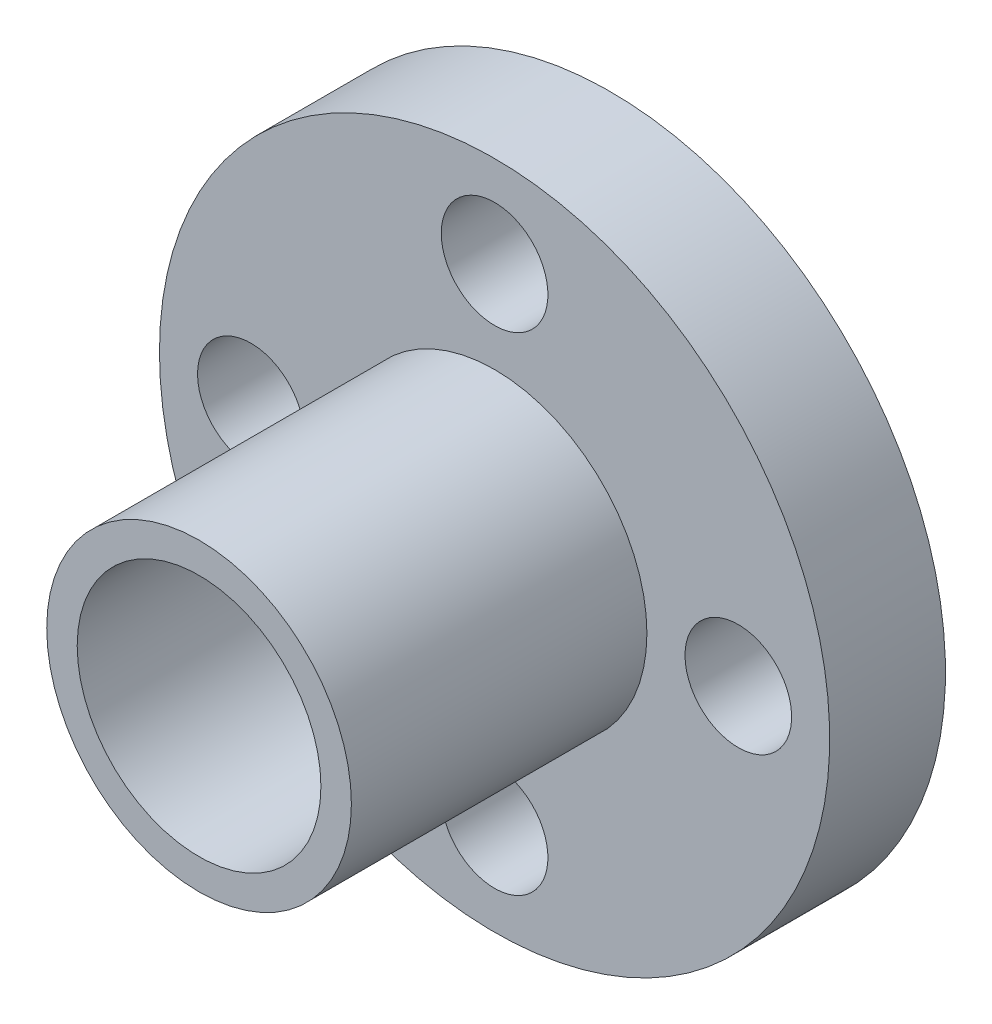
ISO-10303-21;
HEADER;
FILE_DESCRIPTION(('STEP AP214'),'2;1');
FILE_NAME('part.step','',(''),(''),'','','');
FILE_SCHEMA(('AUTOMOTIVE_DESIGN { 1 0 10303 214 1 1 1 1 }'));
ENDSEC;
DATA;
#1=APPLICATION_CONTEXT('core data for automotive mechanical design processes');
#2=APPLICATION_PROTOCOL_DEFINITION('international standard','automotive_design',2000,#1);
#3=PRODUCT_CONTEXT('',#1,'mechanical');
#4=PRODUCT('Part','Part','',(#3));
#5=PRODUCT_RELATED_PRODUCT_CATEGORY('part','',(#4));
#6=PRODUCT_DEFINITION_FORMATION('','',#4);
#7=PRODUCT_DEFINITION_CONTEXT('part definition',#1,'design');
#8=PRODUCT_DEFINITION('design','',#6,#7);
#9=PRODUCT_DEFINITION_SHAPE('','',#8);
#10=(LENGTH_UNIT() NAMED_UNIT(*) SI_UNIT(.MILLI.,.METRE.));
#11=(NAMED_UNIT(*) PLANE_ANGLE_UNIT() SI_UNIT($,.RADIAN.));
#12=(NAMED_UNIT(*) SI_UNIT($,.STERADIAN.) SOLID_ANGLE_UNIT());
#13=UNCERTAINTY_MEASURE_WITH_UNIT(LENGTH_MEASURE(1.E-05),#10,'distance_accuracy_value','');
#14=(GEOMETRIC_REPRESENTATION_CONTEXT(3) GLOBAL_UNCERTAINTY_ASSIGNED_CONTEXT((#13)) GLOBAL_UNIT_ASSIGNED_CONTEXT((#10,
#11,#12)) REPRESENTATION_CONTEXT('',''));
#15=CARTESIAN_POINT('',(0.,0.,0.));
#16=DIRECTION('',(0.,0.,1.));
#17=DIRECTION('',(1.,0.,0.));
#18=AXIS2_PLACEMENT_3D('',#15,#16,#17);
#19=CARTESIAN_POINT('',(0.,0.,3.8));
#20=DIRECTION('',(0.,0.,1.));
#21=DIRECTION('',(1.,0.,0.));
#22=AXIS2_PLACEMENT_3D('',#19,#20,#21);
#23=PLANE('',#22);
#24=CARTESIAN_POINT('',(8.,0.,3.8));
#25=DIRECTION('',(0.,0.,1.));
#26=DIRECTION('',(1.,0.,0.));
#27=AXIS2_PLACEMENT_3D('',#24,#25,#26);
#28=CIRCLE('',#27,1.75);
#29=CARTESIAN_POINT('',(6.25,0.,3.8));
#30=VERTEX_POINT('',#29);
#31=EDGE_CURVE('E57',#30,#30,#28,.T.);
#32=ORIENTED_EDGE('',*,*,#31,.F.);
#33=EDGE_LOOP('',(#32));
#34=FACE_BOUND('',#33,.T.);
#35=CARTESIAN_POINT('',(-8.,0.,3.8));
#36=DIRECTION('',(0.,0.,1.));
#37=DIRECTION('',(1.,0.,0.));
#38=AXIS2_PLACEMENT_3D('',#35,#36,#37);
#39=CIRCLE('',#38,1.75);
#40=CARTESIAN_POINT('',(-9.75,0.,3.8));
#41=VERTEX_POINT('',#40);
#42=EDGE_CURVE('E47',#41,#41,#39,.T.);
#43=ORIENTED_EDGE('',*,*,#42,.F.);
#44=EDGE_LOOP('',(#43));
#45=FACE_BOUND('',#44,.T.);
#46=CARTESIAN_POINT('',(0.,0.,3.8));
#47=DIRECTION('',(0.,0.,1.));
#48=DIRECTION('',(1.,0.,0.));
#49=AXIS2_PLACEMENT_3D('',#46,#47,#48);
#50=CIRCLE('',#49,11.);
#51=CARTESIAN_POINT('',(-11.,0.,3.8));
#52=VERTEX_POINT('',#51);
#53=EDGE_CURVE('E10',#52,#52,#50,.T.);
#54=ORIENTED_EDGE('',*,*,#53,.T.);
#55=EDGE_LOOP('',(#54));
#56=FACE_BOUND('',#55,.T.);
#57=CARTESIAN_POINT('',(0.,0.,3.8));
#58=DIRECTION('',(0.,0.,1.));
#59=DIRECTION('',(1.,0.,0.));
#60=AXIS2_PLACEMENT_3D('',#57,#58,#59);
#61=CIRCLE('',#60,5.);
#62=CARTESIAN_POINT('',(5.,0.,3.8));
#63=VERTEX_POINT('',#62);
#64=EDGE_CURVE('E43',#63,#63,#61,.T.);
#65=ORIENTED_EDGE('',*,*,#64,.F.);
#66=EDGE_LOOP('',(#65));
#67=FACE_BOUND('',#66,.T.);
#68=CARTESIAN_POINT('',(0.,8.,3.8));
#69=DIRECTION('',(0.,0.,1.));
#70=DIRECTION('',(1.,0.,0.));
#71=AXIS2_PLACEMENT_3D('',#68,#69,#70);
#72=CIRCLE('',#71,1.75);
#73=CARTESIAN_POINT('',(-1.74999999999997,8.,3.8));
#74=VERTEX_POINT('',#73);
#75=EDGE_CURVE('E51',#74,#74,#72,.T.);
#76=ORIENTED_EDGE('',*,*,#75,.F.);
#77=EDGE_LOOP('',(#76));
#78=FACE_BOUND('',#77,.T.);
#79=CARTESIAN_POINT('',(0.,-8.,3.8));
#80=DIRECTION('',(0.,0.,1.));
#81=DIRECTION('',(1.,0.,0.));
#82=AXIS2_PLACEMENT_3D('',#79,#80,#81);
#83=CIRCLE('',#82,1.75);
#84=CARTESIAN_POINT('',(-1.75000000000008,-8.,3.8));
#85=VERTEX_POINT('',#84);
#86=EDGE_CURVE('E63',#85,#85,#83,.T.);
#87=ORIENTED_EDGE('',*,*,#86,.F.);
#88=EDGE_LOOP('',(#87));
#89=FACE_BOUND('',#88,.T.);
#90=ADVANCED_FACE('F32',(#34,#45,#56,#67,#78,#89),#23,.T.);
#91=CARTESIAN_POINT('',(0.,0.,0.));
#92=DIRECTION('',(0.,0.,1.));
#93=DIRECTION('',(1.,0.,0.));
#94=AXIS2_PLACEMENT_3D('',#91,#92,#93);
#95=PLANE('',#94);
#96=CARTESIAN_POINT('',(8.,0.,0.));
#97=DIRECTION('',(0.,0.,1.));
#98=DIRECTION('',(1.,0.,0.));
#99=AXIS2_PLACEMENT_3D('',#96,#97,#98);
#100=CIRCLE('',#99,1.75);
#101=CARTESIAN_POINT('',(6.25,0.,0.));
#102=VERTEX_POINT('',#101);
#103=EDGE_CURVE('E60',#102,#102,#100,.T.);
#104=ORIENTED_EDGE('',*,*,#103,.T.);
#105=EDGE_LOOP('',(#104));
#106=FACE_BOUND('',#105,.T.);
#107=CARTESIAN_POINT('',(-8.,0.,0.));
#108=DIRECTION('',(0.,0.,1.));
#109=DIRECTION('',(1.,0.,0.));
#110=AXIS2_PLACEMENT_3D('',#107,#108,#109);
#111=CIRCLE('',#110,1.75);
#112=CARTESIAN_POINT('',(-9.75,0.,0.));
#113=VERTEX_POINT('',#112);
#114=EDGE_CURVE('E48',#113,#113,#111,.T.);
#115=ORIENTED_EDGE('',*,*,#114,.T.);
#116=EDGE_LOOP('',(#115));
#117=FACE_BOUND('',#116,.T.);
#118=CARTESIAN_POINT('',(0.,0.,0.));
#119=DIRECTION('',(0.,0.,1.));
#120=DIRECTION('',(1.,0.,0.));
#121=AXIS2_PLACEMENT_3D('',#118,#119,#120);
#122=CIRCLE('',#121,11.);
#123=CARTESIAN_POINT('',(-11.,0.,0.));
#124=VERTEX_POINT('',#123);
#125=EDGE_CURVE('E36',#124,#124,#122,.T.);
#126=ORIENTED_EDGE('',*,*,#125,.F.);
#127=EDGE_LOOP('',(#126));
#128=FACE_BOUND('',#127,.T.);
#129=CARTESIAN_POINT('',(0.,0.,0.));
#130=DIRECTION('',(0.,0.,1.));
#131=DIRECTION('',(1.,0.,0.));
#132=AXIS2_PLACEMENT_3D('',#129,#130,#131);
#133=CIRCLE('',#132,5.);
#134=CARTESIAN_POINT('',(5.,0.,0.));
#135=VERTEX_POINT('',#134);
#136=EDGE_CURVE('E69',#135,#135,#133,.T.);
#137=ORIENTED_EDGE('',*,*,#136,.T.);
#138=EDGE_LOOP('',(#137));
#139=FACE_BOUND('',#138,.T.);
#140=CARTESIAN_POINT('',(0.,8.,0.));
#141=DIRECTION('',(0.,0.,1.));
#142=DIRECTION('',(1.,0.,0.));
#143=AXIS2_PLACEMENT_3D('',#140,#141,#142);
#144=CIRCLE('',#143,1.75);
#145=CARTESIAN_POINT('',(-1.74999999999997,8.,0.));
#146=VERTEX_POINT('',#145);
#147=EDGE_CURVE('E54',#146,#146,#144,.T.);
#148=ORIENTED_EDGE('',*,*,#147,.T.);
#149=EDGE_LOOP('',(#148));
#150=FACE_BOUND('',#149,.T.);
#151=CARTESIAN_POINT('',(0.,-8.,0.));
#152=DIRECTION('',(0.,0.,1.));
#153=DIRECTION('',(1.,0.,0.));
#154=AXIS2_PLACEMENT_3D('',#151,#152,#153);
#155=CIRCLE('',#154,1.75);
#156=CARTESIAN_POINT('',(-1.75000000000008,-8.,0.));
#157=VERTEX_POINT('',#156);
#158=EDGE_CURVE('E66',#157,#157,#155,.T.);
#159=ORIENTED_EDGE('',*,*,#158,.T.);
#160=EDGE_LOOP('',(#159));
#161=FACE_BOUND('',#160,.T.);
#162=ADVANCED_FACE('F110',(#106,#117,#128,#139,#150,#161),#95,.F.);
#163=CARTESIAN_POINT('',(0.,0.,3.8));
#164=DIRECTION('',(0.,0.,-1.));
#165=DIRECTION('',(-1.,0.,0.));
#166=AXIS2_PLACEMENT_3D('',#163,#164,#165);
#167=CYLINDRICAL_SURFACE('',#166,11.);
#168=CARTESIAN_POINT('',(-11.,0.,3.8));
#169=CARTESIAN_POINT('',(-11.,0.,3.76041666666667));
#170=CARTESIAN_POINT('',(-11.,0.,3.72083333333333));
#171=CARTESIAN_POINT('',(-11.,0.,3.64166666666667));
#172=CARTESIAN_POINT('',(-11.,0.,3.60208333333333));
#173=CARTESIAN_POINT('',(-11.,0.,3.52291666666667));
#174=CARTESIAN_POINT('',(-11.,0.,3.48333333333333));
#175=CARTESIAN_POINT('',(-11.,0.,3.40416666666667));
#176=CARTESIAN_POINT('',(-11.,0.,3.36458333333333));
#177=CARTESIAN_POINT('',(-11.,0.,3.28541666666667));
#178=CARTESIAN_POINT('',(-11.,0.,3.24583333333333));
#179=CARTESIAN_POINT('',(-11.,0.,3.16666666666667));
#180=CARTESIAN_POINT('',(-11.,0.,3.12708333333333));
#181=CARTESIAN_POINT('',(-11.,0.,3.04791666666667));
#182=CARTESIAN_POINT('',(-11.,0.,3.00833333333333));
#183=CARTESIAN_POINT('',(-11.,0.,2.92916666666667));
#184=CARTESIAN_POINT('',(-11.,0.,2.88958333333333));
#185=CARTESIAN_POINT('',(-11.,0.,2.81041666666667));
#186=CARTESIAN_POINT('',(-11.,0.,2.77083333333333));
#187=CARTESIAN_POINT('',(-11.,0.,2.69166666666667));
#188=CARTESIAN_POINT('',(-11.,0.,2.65208333333333));
#189=CARTESIAN_POINT('',(-11.,0.,2.57291666666667));
#190=CARTESIAN_POINT('',(-11.,0.,2.53333333333333));
#191=CARTESIAN_POINT('',(-11.,0.,2.45416666666667));
#192=CARTESIAN_POINT('',(-11.,0.,2.41458333333333));
#193=CARTESIAN_POINT('',(-11.,0.,2.33541666666667));
#194=CARTESIAN_POINT('',(-11.,0.,2.29583333333333));
#195=CARTESIAN_POINT('',(-11.,0.,2.21666666666667));
#196=CARTESIAN_POINT('',(-11.,0.,2.17708333333333));
#197=CARTESIAN_POINT('',(-11.,0.,2.09791666666667));
#198=CARTESIAN_POINT('',(-11.,0.,2.05833333333333));
#199=CARTESIAN_POINT('',(-11.,0.,1.97916666666667));
#200=CARTESIAN_POINT('',(-11.,0.,1.93958333333333));
#201=CARTESIAN_POINT('',(-11.,0.,1.86041666666667));
#202=CARTESIAN_POINT('',(-11.,0.,1.82083333333333));
#203=CARTESIAN_POINT('',(-11.,0.,1.74166666666667));
#204=CARTESIAN_POINT('',(-11.,0.,1.70208333333333));
#205=CARTESIAN_POINT('',(-11.,0.,1.62291666666667));
#206=CARTESIAN_POINT('',(-11.,0.,1.58333333333333));
#207=CARTESIAN_POINT('',(-11.,0.,1.50416666666667));
#208=CARTESIAN_POINT('',(-11.,0.,1.46458333333333));
#209=CARTESIAN_POINT('',(-11.,0.,1.38541666666667));
#210=CARTESIAN_POINT('',(-11.,0.,1.34583333333333));
#211=CARTESIAN_POINT('',(-11.,0.,1.26666666666667));
#212=CARTESIAN_POINT('',(-11.,0.,1.22708333333333));
#213=CARTESIAN_POINT('',(-11.,0.,1.14791666666667));
#214=CARTESIAN_POINT('',(-11.,0.,1.10833333333333));
#215=CARTESIAN_POINT('',(-11.,0.,1.02916666666667));
#216=CARTESIAN_POINT('',(-11.,0.,0.989583333333333));
#217=CARTESIAN_POINT('',(-11.,0.,0.910416666666667));
#218=CARTESIAN_POINT('',(-11.,0.,0.870833333333333));
#219=CARTESIAN_POINT('',(-11.,0.,0.791666666666667));
#220=CARTESIAN_POINT('',(-11.,0.,0.752083333333333));
#221=CARTESIAN_POINT('',(-11.,0.,0.672916666666667));
#222=CARTESIAN_POINT('',(-11.,0.,0.633333333333333));
#223=CARTESIAN_POINT('',(-11.,0.,0.554166666666667));
#224=CARTESIAN_POINT('',(-11.,0.,0.514583333333334));
#225=CARTESIAN_POINT('',(-11.,0.,0.435416666666667));
#226=CARTESIAN_POINT('',(-11.,0.,0.395833333333333));
#227=CARTESIAN_POINT('',(-11.,0.,0.316666666666666));
#228=CARTESIAN_POINT('',(-11.,0.,0.277083333333333));
#229=CARTESIAN_POINT('',(-11.,0.,0.197916666666667));
#230=CARTESIAN_POINT('',(-11.,0.,0.158333333333333));
#231=CARTESIAN_POINT('',(-11.,0.,0.0791666666666666));
#232=CARTESIAN_POINT('',(-11.,0.,0.0395833333333333));
#233=CARTESIAN_POINT('',(-11.,0.,0.));
#234=B_SPLINE_CURVE_WITH_KNOTS('',3,(#168,#169,#170,#171,#172,#173,#174,#175,#176,#177,#178,
#179,#180,#181,#182,#183,#184,#185,#186,#187,#188,#189,#190,#191,#192,#193,#194,#195,#196,#197,
#198,#199,#200,#201,#202,#203,#204,#205,#206,#207,#208,#209,#210,#211,#212,#213,#214,#215,#216,
#217,#218,#219,#220,#221,#222,#223,#224,#225,#226,#227,#228,#229,#230,#231,#232,#233),
.UNSPECIFIED.,.F.,.F.,(4,2,2,2,2,2,2,2,2,2,2,2,2,2,2,2,2,2,2,2,2,2,2,2,2,2,2,2,2,2,2,2,4),(0.,
0.11875,0.2375,0.35625,0.475,0.59375,0.7125,0.831249999999999,0.95,1.06875,1.1875,1.30625,1.425,
1.54375,1.6625,1.78125,1.9,2.01875,2.1375,2.25625,2.375,2.49375,2.6125,2.73125,2.85,2.96875,
3.0875,3.20625,3.325,3.44375,3.5625,3.68125,3.8),.UNSPECIFIED.);
#235=EDGE_CURVE('BSEAM34',#52,#124,#234,.T.);
#236=ORIENTED_EDGE('',*,*,#53,.F.);
#237=ORIENTED_EDGE('',*,*,#125,.T.);
#238=ORIENTED_EDGE('',*,*,#235,.T.);
#239=ORIENTED_EDGE('',*,*,#235,.F.);
#240=EDGE_LOOP('',(#236,#238,#237,#239));
#241=FACE_BOUND('',#240,.T.);
#242=ADVANCED_FACE('F34',(#241),#167,.T.);
#243=CARTESIAN_POINT('',(-8.,0.,3.8));
#244=DIRECTION('',(0.,0.,-1.));
#245=DIRECTION('',(-1.,0.,0.));
#246=AXIS2_PLACEMENT_3D('',#243,#244,#245);
#247=CYLINDRICAL_SURFACE('',#246,1.75);
#248=CARTESIAN_POINT('',(-9.75,0.,3.8));
#249=CARTESIAN_POINT('',(-9.75,0.,3.76041666666667));
#250=CARTESIAN_POINT('',(-9.75,0.,3.72083333333333));
#251=CARTESIAN_POINT('',(-9.75,0.,3.64166666666667));
#252=CARTESIAN_POINT('',(-9.75,0.,3.60208333333333));
#253=CARTESIAN_POINT('',(-9.75,0.,3.52291666666667));
#254=CARTESIAN_POINT('',(-9.75,0.,3.48333333333333));
#255=CARTESIAN_POINT('',(-9.75,0.,3.40416666666667));
#256=CARTESIAN_POINT('',(-9.75,0.,3.36458333333333));
#257=CARTESIAN_POINT('',(-9.75,0.,3.28541666666667));
#258=CARTESIAN_POINT('',(-9.75,0.,3.24583333333333));
#259=CARTESIAN_POINT('',(-9.75,0.,3.16666666666667));
#260=CARTESIAN_POINT('',(-9.75,0.,3.12708333333333));
#261=CARTESIAN_POINT('',(-9.75,0.,3.04791666666667));
#262=CARTESIAN_POINT('',(-9.75,0.,3.00833333333333));
#263=CARTESIAN_POINT('',(-9.75,0.,2.92916666666667));
#264=CARTESIAN_POINT('',(-9.75,0.,2.88958333333333));
#265=CARTESIAN_POINT('',(-9.75,0.,2.81041666666667));
#266=CARTESIAN_POINT('',(-9.75,0.,2.77083333333333));
#267=CARTESIAN_POINT('',(-9.75,0.,2.69166666666667));
#268=CARTESIAN_POINT('',(-9.75,0.,2.65208333333333));
#269=CARTESIAN_POINT('',(-9.75,0.,2.57291666666667));
#270=CARTESIAN_POINT('',(-9.75,0.,2.53333333333333));
#271=CARTESIAN_POINT('',(-9.75,0.,2.45416666666667));
#272=CARTESIAN_POINT('',(-9.75,0.,2.41458333333333));
#273=CARTESIAN_POINT('',(-9.75,0.,2.33541666666667));
#274=CARTESIAN_POINT('',(-9.75,0.,2.29583333333333));
#275=CARTESIAN_POINT('',(-9.75,0.,2.21666666666667));
#276=CARTESIAN_POINT('',(-9.75,0.,2.17708333333333));
#277=CARTESIAN_POINT('',(-9.75,0.,2.09791666666667));
#278=CARTESIAN_POINT('',(-9.75,0.,2.05833333333333));
#279=CARTESIAN_POINT('',(-9.75,0.,1.97916666666667));
#280=CARTESIAN_POINT('',(-9.75,0.,1.93958333333333));
#281=CARTESIAN_POINT('',(-9.75,0.,1.86041666666667));
#282=CARTESIAN_POINT('',(-9.75,0.,1.82083333333333));
#283=CARTESIAN_POINT('',(-9.75,0.,1.74166666666667));
#284=CARTESIAN_POINT('',(-9.75,0.,1.70208333333333));
#285=CARTESIAN_POINT('',(-9.75,0.,1.62291666666667));
#286=CARTESIAN_POINT('',(-9.75,0.,1.58333333333333));
#287=CARTESIAN_POINT('',(-9.75,0.,1.50416666666667));
#288=CARTESIAN_POINT('',(-9.75,0.,1.46458333333333));
#289=CARTESIAN_POINT('',(-9.75,0.,1.38541666666667));
#290=CARTESIAN_POINT('',(-9.75,0.,1.34583333333333));
#291=CARTESIAN_POINT('',(-9.75,0.,1.26666666666667));
#292=CARTESIAN_POINT('',(-9.75,0.,1.22708333333333));
#293=CARTESIAN_POINT('',(-9.75,0.,1.14791666666667));
#294=CARTESIAN_POINT('',(-9.75,0.,1.10833333333333));
#295=CARTESIAN_POINT('',(-9.75,0.,1.02916666666667));
#296=CARTESIAN_POINT('',(-9.75,0.,0.989583333333333));
#297=CARTESIAN_POINT('',(-9.75,0.,0.910416666666667));
#298=CARTESIAN_POINT('',(-9.75,0.,0.870833333333333));
#299=CARTESIAN_POINT('',(-9.75,0.,0.791666666666667));
#300=CARTESIAN_POINT('',(-9.75,0.,0.752083333333333));
#301=CARTESIAN_POINT('',(-9.75,0.,0.672916666666667));
#302=CARTESIAN_POINT('',(-9.75,0.,0.633333333333333));
#303=CARTESIAN_POINT('',(-9.75,0.,0.554166666666667));
#304=CARTESIAN_POINT('',(-9.75,0.,0.514583333333334));
#305=CARTESIAN_POINT('',(-9.75,0.,0.435416666666667));
#306=CARTESIAN_POINT('',(-9.75,0.,0.395833333333333));
#307=CARTESIAN_POINT('',(-9.75,0.,0.316666666666666));
#308=CARTESIAN_POINT('',(-9.75,0.,0.277083333333333));
#309=CARTESIAN_POINT('',(-9.75,0.,0.197916666666667));
#310=CARTESIAN_POINT('',(-9.75,0.,0.158333333333333));
#311=CARTESIAN_POINT('',(-9.75,0.,0.0791666666666666));
#312=CARTESIAN_POINT('',(-9.75,0.,0.0395833333333333));
#313=CARTESIAN_POINT('',(-9.75,0.,0.));
#314=B_SPLINE_CURVE_WITH_KNOTS('',3,(#248,#249,#250,#251,#252,#253,#254,#255,#256,#257,#258,
#259,#260,#261,#262,#263,#264,#265,#266,#267,#268,#269,#270,#271,#272,#273,#274,#275,#276,#277,
#278,#279,#280,#281,#282,#283,#284,#285,#286,#287,#288,#289,#290,#291,#292,#293,#294,#295,#296,
#297,#298,#299,#300,#301,#302,#303,#304,#305,#306,#307,#308,#309,#310,#311,#312,#313),
.UNSPECIFIED.,.F.,.F.,(4,2,2,2,2,2,2,2,2,2,2,2,2,2,2,2,2,2,2,2,2,2,2,2,2,2,2,2,2,2,2,2,4),(0.,
0.11875,0.2375,0.35625,0.475,0.59375,0.7125,0.831249999999999,0.95,1.06875,1.1875,1.30625,1.425,
1.54375,1.6625,1.78125,1.9,2.01875,2.1375,2.25625,2.375,2.49375,2.6125,2.73125,2.85,2.96875,
3.0875,3.20625,3.325,3.44375,3.5625,3.68125,3.8),.UNSPECIFIED.);
#315=EDGE_CURVE('BSEAM136',#41,#113,#314,.T.);
#316=ORIENTED_EDGE('',*,*,#42,.T.);
#317=ORIENTED_EDGE('',*,*,#114,.F.);
#318=ORIENTED_EDGE('',*,*,#315,.T.);
#319=ORIENTED_EDGE('',*,*,#315,.F.);
#320=EDGE_LOOP('',(#316,#318,#317,#319));
#321=FACE_BOUND('',#320,.T.);
#322=ADVANCED_FACE('F136',(#321),#247,.F.);
#323=CARTESIAN_POINT('',(0.,8.,3.8));
#324=DIRECTION('',(0.,0.,-1.));
#325=DIRECTION('',(-1.,0.,0.));
#326=AXIS2_PLACEMENT_3D('',#323,#324,#325);
#327=CYLINDRICAL_SURFACE('',#326,1.75);
#328=CARTESIAN_POINT('',(-1.74999999999997,8.,3.8));
#329=CARTESIAN_POINT('',(-1.74999999999997,8.,3.76041666666667));
#330=CARTESIAN_POINT('',(-1.74999999999997,8.,3.72083333333333));
#331=CARTESIAN_POINT('',(-1.74999999999997,8.,3.64166666666667));
#332=CARTESIAN_POINT('',(-1.74999999999997,8.,3.60208333333333));
#333=CARTESIAN_POINT('',(-1.74999999999997,8.,3.52291666666667));
#334=CARTESIAN_POINT('',(-1.74999999999997,8.,3.48333333333333));
#335=CARTESIAN_POINT('',(-1.74999999999997,8.,3.40416666666667));
#336=CARTESIAN_POINT('',(-1.74999999999997,8.,3.36458333333333));
#337=CARTESIAN_POINT('',(-1.74999999999997,8.,3.28541666666667));
#338=CARTESIAN_POINT('',(-1.74999999999997,8.,3.24583333333333));
#339=CARTESIAN_POINT('',(-1.74999999999997,8.,3.16666666666667));
#340=CARTESIAN_POINT('',(-1.74999999999997,8.,3.12708333333333));
#341=CARTESIAN_POINT('',(-1.74999999999997,8.,3.04791666666667));
#342=CARTESIAN_POINT('',(-1.74999999999997,8.,3.00833333333333));
#343=CARTESIAN_POINT('',(-1.74999999999997,8.,2.92916666666667));
#344=CARTESIAN_POINT('',(-1.74999999999997,8.,2.88958333333333));
#345=CARTESIAN_POINT('',(-1.74999999999997,8.,2.81041666666667));
#346=CARTESIAN_POINT('',(-1.74999999999997,8.,2.77083333333333));
#347=CARTESIAN_POINT('',(-1.74999999999997,8.,2.69166666666667));
#348=CARTESIAN_POINT('',(-1.74999999999997,8.,2.65208333333333));
#349=CARTESIAN_POINT('',(-1.74999999999997,8.,2.57291666666667));
#350=CARTESIAN_POINT('',(-1.74999999999997,8.,2.53333333333333));
#351=CARTESIAN_POINT('',(-1.74999999999997,8.,2.45416666666667));
#352=CARTESIAN_POINT('',(-1.74999999999997,8.,2.41458333333333));
#353=CARTESIAN_POINT('',(-1.74999999999997,8.,2.33541666666667));
#354=CARTESIAN_POINT('',(-1.74999999999997,8.,2.29583333333333));
#355=CARTESIAN_POINT('',(-1.74999999999997,8.,2.21666666666667));
#356=CARTESIAN_POINT('',(-1.74999999999997,8.,2.17708333333333));
#357=CARTESIAN_POINT('',(-1.74999999999997,8.,2.09791666666667));
#358=CARTESIAN_POINT('',(-1.74999999999997,8.,2.05833333333333));
#359=CARTESIAN_POINT('',(-1.74999999999997,8.,1.97916666666667));
#360=CARTESIAN_POINT('',(-1.74999999999997,8.,1.93958333333333));
#361=CARTESIAN_POINT('',(-1.74999999999997,8.,1.86041666666667));
#362=CARTESIAN_POINT('',(-1.74999999999997,8.,1.82083333333333));
#363=CARTESIAN_POINT('',(-1.74999999999997,8.,1.74166666666667));
#364=CARTESIAN_POINT('',(-1.74999999999997,8.,1.70208333333333));
#365=CARTESIAN_POINT('',(-1.74999999999997,8.,1.62291666666667));
#366=CARTESIAN_POINT('',(-1.74999999999997,8.,1.58333333333333));
#367=CARTESIAN_POINT('',(-1.74999999999997,8.,1.50416666666667));
#368=CARTESIAN_POINT('',(-1.74999999999997,8.,1.46458333333333));
#369=CARTESIAN_POINT('',(-1.74999999999997,8.,1.38541666666667));
#370=CARTESIAN_POINT('',(-1.74999999999997,8.,1.34583333333333));
#371=CARTESIAN_POINT('',(-1.74999999999997,8.,1.26666666666667));
#372=CARTESIAN_POINT('',(-1.74999999999997,8.,1.22708333333333));
#373=CARTESIAN_POINT('',(-1.74999999999997,8.,1.14791666666667));
#374=CARTESIAN_POINT('',(-1.74999999999997,8.,1.10833333333333));
#375=CARTESIAN_POINT('',(-1.74999999999997,8.,1.02916666666667));
#376=CARTESIAN_POINT('',(-1.74999999999997,8.,0.989583333333333));
#377=CARTESIAN_POINT('',(-1.74999999999997,8.,0.910416666666667));
#378=CARTESIAN_POINT('',(-1.74999999999997,8.,0.870833333333333));
#379=CARTESIAN_POINT('',(-1.74999999999997,8.,0.791666666666667));
#380=CARTESIAN_POINT('',(-1.74999999999997,8.,0.752083333333333));
#381=CARTESIAN_POINT('',(-1.74999999999997,8.,0.672916666666667));
#382=CARTESIAN_POINT('',(-1.74999999999997,8.,0.633333333333333));
#383=CARTESIAN_POINT('',(-1.74999999999997,8.,0.554166666666667));
#384=CARTESIAN_POINT('',(-1.74999999999997,8.,0.514583333333334));
#385=CARTESIAN_POINT('',(-1.74999999999997,8.,0.435416666666667));
#386=CARTESIAN_POINT('',(-1.74999999999997,8.,0.395833333333333));
#387=CARTESIAN_POINT('',(-1.74999999999997,8.,0.316666666666666));
#388=CARTESIAN_POINT('',(-1.74999999999997,8.,0.277083333333333));
#389=CARTESIAN_POINT('',(-1.74999999999997,8.,0.197916666666667));
#390=CARTESIAN_POINT('',(-1.74999999999997,8.,0.158333333333333));
#391=CARTESIAN_POINT('',(-1.74999999999997,8.,0.0791666666666666));
#392=CARTESIAN_POINT('',(-1.74999999999997,8.,0.0395833333333333));
#393=CARTESIAN_POINT('',(-1.74999999999997,8.,0.));
#394=B_SPLINE_CURVE_WITH_KNOTS('',3,(#328,#329,#330,#331,#332,#333,#334,#335,#336,#337,#338,
#339,#340,#341,#342,#343,#344,#345,#346,#347,#348,#349,#350,#351,#352,#353,#354,#355,#356,#357,
#358,#359,#360,#361,#362,#363,#364,#365,#366,#367,#368,#369,#370,#371,#372,#373,#374,#375,#376,
#377,#378,#379,#380,#381,#382,#383,#384,#385,#386,#387,#388,#389,#390,#391,#392,#393),
.UNSPECIFIED.,.F.,.F.,(4,2,2,2,2,2,2,2,2,2,2,2,2,2,2,2,2,2,2,2,2,2,2,2,2,2,2,2,2,2,2,2,4),(0.,
0.11875,0.2375,0.35625,0.475,0.59375,0.7125,0.831249999999999,0.95,1.06875,1.1875,1.30625,1.425,
1.54375,1.6625,1.78125,1.9,2.01875,2.1375,2.25625,2.375,2.49375,2.6125,2.73125,2.85,2.96875,
3.0875,3.20625,3.325,3.44375,3.5625,3.68125,3.8),.UNSPECIFIED.);
#395=EDGE_CURVE('BSEAM125',#74,#146,#394,.T.);
#396=ORIENTED_EDGE('',*,*,#75,.T.);
#397=ORIENTED_EDGE('',*,*,#147,.F.);
#398=ORIENTED_EDGE('',*,*,#395,.T.);
#399=ORIENTED_EDGE('',*,*,#395,.F.);
#400=EDGE_LOOP('',(#396,#398,#397,#399));
#401=FACE_BOUND('',#400,.T.);
#402=ADVANCED_FACE('F125',(#401),#327,.F.);
#403=CARTESIAN_POINT('',(8.,0.,3.8));
#404=DIRECTION('',(0.,0.,-1.));
#405=DIRECTION('',(-1.,0.,0.));
#406=AXIS2_PLACEMENT_3D('',#403,#404,#405);
#407=CYLINDRICAL_SURFACE('',#406,1.75);
#408=CARTESIAN_POINT('',(6.25,0.,3.8));
#409=CARTESIAN_POINT('',(6.25,0.,3.76041666666667));
#410=CARTESIAN_POINT('',(6.25,0.,3.72083333333333));
#411=CARTESIAN_POINT('',(6.25,0.,3.64166666666667));
#412=CARTESIAN_POINT('',(6.25,0.,3.60208333333333));
#413=CARTESIAN_POINT('',(6.25,0.,3.52291666666667));
#414=CARTESIAN_POINT('',(6.25,0.,3.48333333333333));
#415=CARTESIAN_POINT('',(6.25,0.,3.40416666666667));
#416=CARTESIAN_POINT('',(6.25,0.,3.36458333333333));
#417=CARTESIAN_POINT('',(6.25,0.,3.28541666666667));
#418=CARTESIAN_POINT('',(6.25,0.,3.24583333333333));
#419=CARTESIAN_POINT('',(6.25,0.,3.16666666666667));
#420=CARTESIAN_POINT('',(6.25,0.,3.12708333333333));
#421=CARTESIAN_POINT('',(6.25,0.,3.04791666666667));
#422=CARTESIAN_POINT('',(6.25,0.,3.00833333333333));
#423=CARTESIAN_POINT('',(6.25,0.,2.92916666666667));
#424=CARTESIAN_POINT('',(6.25,0.,2.88958333333333));
#425=CARTESIAN_POINT('',(6.25,0.,2.81041666666667));
#426=CARTESIAN_POINT('',(6.25,0.,2.77083333333333));
#427=CARTESIAN_POINT('',(6.25,0.,2.69166666666667));
#428=CARTESIAN_POINT('',(6.25,0.,2.65208333333333));
#429=CARTESIAN_POINT('',(6.25,0.,2.57291666666667));
#430=CARTESIAN_POINT('',(6.25,0.,2.53333333333333));
#431=CARTESIAN_POINT('',(6.25,0.,2.45416666666667));
#432=CARTESIAN_POINT('',(6.25,0.,2.41458333333333));
#433=CARTESIAN_POINT('',(6.25,0.,2.33541666666667));
#434=CARTESIAN_POINT('',(6.25,0.,2.29583333333333));
#435=CARTESIAN_POINT('',(6.25,0.,2.21666666666667));
#436=CARTESIAN_POINT('',(6.25,0.,2.17708333333333));
#437=CARTESIAN_POINT('',(6.25,0.,2.09791666666667));
#438=CARTESIAN_POINT('',(6.25,0.,2.05833333333333));
#439=CARTESIAN_POINT('',(6.25,0.,1.97916666666667));
#440=CARTESIAN_POINT('',(6.25,0.,1.93958333333333));
#441=CARTESIAN_POINT('',(6.25,0.,1.86041666666667));
#442=CARTESIAN_POINT('',(6.25,0.,1.82083333333333));
#443=CARTESIAN_POINT('',(6.25,0.,1.74166666666667));
#444=CARTESIAN_POINT('',(6.25,0.,1.70208333333333));
#445=CARTESIAN_POINT('',(6.25,0.,1.62291666666667));
#446=CARTESIAN_POINT('',(6.25,0.,1.58333333333333));
#447=CARTESIAN_POINT('',(6.25,0.,1.50416666666667));
#448=CARTESIAN_POINT('',(6.25,0.,1.46458333333333));
#449=CARTESIAN_POINT('',(6.25,0.,1.38541666666667));
#450=CARTESIAN_POINT('',(6.25,0.,1.34583333333333));
#451=CARTESIAN_POINT('',(6.25,0.,1.26666666666667));
#452=CARTESIAN_POINT('',(6.25,0.,1.22708333333333));
#453=CARTESIAN_POINT('',(6.25,0.,1.14791666666667));
#454=CARTESIAN_POINT('',(6.25,0.,1.10833333333333));
#455=CARTESIAN_POINT('',(6.25,0.,1.02916666666667));
#456=CARTESIAN_POINT('',(6.25,0.,0.989583333333333));
#457=CARTESIAN_POINT('',(6.25,0.,0.910416666666667));
#458=CARTESIAN_POINT('',(6.25,0.,0.870833333333333));
#459=CARTESIAN_POINT('',(6.25,0.,0.791666666666667));
#460=CARTESIAN_POINT('',(6.25,0.,0.752083333333333));
#461=CARTESIAN_POINT('',(6.25,0.,0.672916666666667));
#462=CARTESIAN_POINT('',(6.25,0.,0.633333333333333));
#463=CARTESIAN_POINT('',(6.25,0.,0.554166666666667));
#464=CARTESIAN_POINT('',(6.25,0.,0.514583333333334));
#465=CARTESIAN_POINT('',(6.25,0.,0.435416666666667));
#466=CARTESIAN_POINT('',(6.25,0.,0.395833333333333));
#467=CARTESIAN_POINT('',(6.25,0.,0.316666666666666));
#468=CARTESIAN_POINT('',(6.25,0.,0.277083333333333));
#469=CARTESIAN_POINT('',(6.25,0.,0.197916666666667));
#470=CARTESIAN_POINT('',(6.25,0.,0.158333333333333));
#471=CARTESIAN_POINT('',(6.25,0.,0.0791666666666666));
#472=CARTESIAN_POINT('',(6.25,0.,0.0395833333333333));
#473=CARTESIAN_POINT('',(6.25,0.,0.));
#474=B_SPLINE_CURVE_WITH_KNOTS('',3,(#408,#409,#410,#411,#412,#413,#414,#415,#416,#417,#418,
#419,#420,#421,#422,#423,#424,#425,#426,#427,#428,#429,#430,#431,#432,#433,#434,#435,#436,#437,
#438,#439,#440,#441,#442,#443,#444,#445,#446,#447,#448,#449,#450,#451,#452,#453,#454,#455,#456,
#457,#458,#459,#460,#461,#462,#463,#464,#465,#466,#467,#468,#469,#470,#471,#472,#473),
.UNSPECIFIED.,.F.,.F.,(4,2,2,2,2,2,2,2,2,2,2,2,2,2,2,2,2,2,2,2,2,2,2,2,2,2,2,2,2,2,2,2,4),(0.,
0.11875,0.2375,0.35625,0.475,0.59375,0.7125,0.831249999999999,0.95,1.06875,1.1875,1.30625,1.425,
1.54375,1.6625,1.78125,1.9,2.01875,2.1375,2.25625,2.375,2.49375,2.6125,2.73125,2.85,2.96875,
3.0875,3.20625,3.325,3.44375,3.5625,3.68125,3.8),.UNSPECIFIED.);
#475=EDGE_CURVE('BSEAM119',#30,#102,#474,.T.);
#476=ORIENTED_EDGE('',*,*,#31,.T.);
#477=ORIENTED_EDGE('',*,*,#103,.F.);
#478=ORIENTED_EDGE('',*,*,#475,.T.);
#479=ORIENTED_EDGE('',*,*,#475,.F.);
#480=EDGE_LOOP('',(#476,#478,#477,#479));
#481=FACE_BOUND('',#480,.T.);
#482=ADVANCED_FACE('F119',(#481),#407,.F.);
#483=CARTESIAN_POINT('',(0.,-8.,3.8));
#484=DIRECTION('',(0.,0.,-1.));
#485=DIRECTION('',(-1.,0.,0.));
#486=AXIS2_PLACEMENT_3D('',#483,#484,#485);
#487=CYLINDRICAL_SURFACE('',#486,1.75);
#488=CARTESIAN_POINT('',(-1.75000000000008,-8.,3.8));
#489=CARTESIAN_POINT('',(-1.75000000000008,-8.,3.76041666666667));
#490=CARTESIAN_POINT('',(-1.75000000000008,-8.,3.72083333333333));
#491=CARTESIAN_POINT('',(-1.75000000000008,-8.,3.64166666666667));
#492=CARTESIAN_POINT('',(-1.75000000000008,-8.,3.60208333333333));
#493=CARTESIAN_POINT('',(-1.75000000000008,-8.,3.52291666666667));
#494=CARTESIAN_POINT('',(-1.75000000000008,-8.,3.48333333333333));
#495=CARTESIAN_POINT('',(-1.75000000000008,-8.,3.40416666666667));
#496=CARTESIAN_POINT('',(-1.75000000000008,-8.,3.36458333333333));
#497=CARTESIAN_POINT('',(-1.75000000000008,-8.,3.28541666666667));
#498=CARTESIAN_POINT('',(-1.75000000000008,-8.,3.24583333333333));
#499=CARTESIAN_POINT('',(-1.75000000000008,-8.,3.16666666666667));
#500=CARTESIAN_POINT('',(-1.75000000000008,-8.,3.12708333333333));
#501=CARTESIAN_POINT('',(-1.75000000000008,-8.,3.04791666666667));
#502=CARTESIAN_POINT('',(-1.75000000000008,-8.,3.00833333333333));
#503=CARTESIAN_POINT('',(-1.75000000000008,-8.,2.92916666666667));
#504=CARTESIAN_POINT('',(-1.75000000000008,-8.,2.88958333333333));
#505=CARTESIAN_POINT('',(-1.75000000000008,-8.,2.81041666666667));
#506=CARTESIAN_POINT('',(-1.75000000000008,-8.,2.77083333333333));
#507=CARTESIAN_POINT('',(-1.75000000000008,-8.,2.69166666666667));
#508=CARTESIAN_POINT('',(-1.75000000000008,-8.,2.65208333333333));
#509=CARTESIAN_POINT('',(-1.75000000000008,-8.,2.57291666666667));
#510=CARTESIAN_POINT('',(-1.75000000000008,-8.,2.53333333333333));
#511=CARTESIAN_POINT('',(-1.75000000000008,-8.,2.45416666666667));
#512=CARTESIAN_POINT('',(-1.75000000000008,-8.,2.41458333333333));
#513=CARTESIAN_POINT('',(-1.75000000000008,-8.,2.33541666666667));
#514=CARTESIAN_POINT('',(-1.75000000000008,-8.,2.29583333333333));
#515=CARTESIAN_POINT('',(-1.75000000000008,-8.,2.21666666666667));
#516=CARTESIAN_POINT('',(-1.75000000000008,-8.,2.17708333333333));
#517=CARTESIAN_POINT('',(-1.75000000000008,-8.,2.09791666666667));
#518=CARTESIAN_POINT('',(-1.75000000000008,-8.,2.05833333333333));
#519=CARTESIAN_POINT('',(-1.75000000000008,-8.,1.97916666666667));
#520=CARTESIAN_POINT('',(-1.75000000000008,-8.,1.93958333333333));
#521=CARTESIAN_POINT('',(-1.75000000000008,-8.,1.86041666666667));
#522=CARTESIAN_POINT('',(-1.75000000000008,-8.,1.82083333333333));
#523=CARTESIAN_POINT('',(-1.75000000000008,-8.,1.74166666666667));
#524=CARTESIAN_POINT('',(-1.75000000000008,-8.,1.70208333333333));
#525=CARTESIAN_POINT('',(-1.75000000000008,-8.,1.62291666666667));
#526=CARTESIAN_POINT('',(-1.75000000000008,-8.,1.58333333333333));
#527=CARTESIAN_POINT('',(-1.75000000000008,-8.,1.50416666666667));
#528=CARTESIAN_POINT('',(-1.75000000000008,-8.,1.46458333333333));
#529=CARTESIAN_POINT('',(-1.75000000000008,-8.,1.38541666666667));
#530=CARTESIAN_POINT('',(-1.75000000000008,-8.,1.34583333333333));
#531=CARTESIAN_POINT('',(-1.75000000000008,-8.,1.26666666666667));
#532=CARTESIAN_POINT('',(-1.75000000000008,-8.,1.22708333333333));
#533=CARTESIAN_POINT('',(-1.75000000000008,-8.,1.14791666666667));
#534=CARTESIAN_POINT('',(-1.75000000000008,-8.,1.10833333333333));
#535=CARTESIAN_POINT('',(-1.75000000000008,-8.,1.02916666666667));
#536=CARTESIAN_POINT('',(-1.75000000000008,-8.,0.989583333333333));
#537=CARTESIAN_POINT('',(-1.75000000000008,-8.,0.910416666666667));
#538=CARTESIAN_POINT('',(-1.75000000000008,-8.,0.870833333333333));
#539=CARTESIAN_POINT('',(-1.75000000000008,-8.,0.791666666666667));
#540=CARTESIAN_POINT('',(-1.75000000000008,-8.,0.752083333333333));
#541=CARTESIAN_POINT('',(-1.75000000000008,-8.,0.672916666666667));
#542=CARTESIAN_POINT('',(-1.75000000000008,-8.,0.633333333333333));
#543=CARTESIAN_POINT('',(-1.75000000000008,-8.,0.554166666666667));
#544=CARTESIAN_POINT('',(-1.75000000000008,-8.,0.514583333333334));
#545=CARTESIAN_POINT('',(-1.75000000000008,-8.,0.435416666666667));
#546=CARTESIAN_POINT('',(-1.75000000000008,-8.,0.395833333333333));
#547=CARTESIAN_POINT('',(-1.75000000000008,-8.,0.316666666666666));
#548=CARTESIAN_POINT('',(-1.75000000000008,-8.,0.277083333333333));
#549=CARTESIAN_POINT('',(-1.75000000000008,-8.,0.197916666666667));
#550=CARTESIAN_POINT('',(-1.75000000000008,-8.,0.158333333333333));
#551=CARTESIAN_POINT('',(-1.75000000000008,-8.,0.0791666666666666));
#552=CARTESIAN_POINT('',(-1.75000000000008,-8.,0.0395833333333333));
#553=CARTESIAN_POINT('',(-1.75000000000008,-8.,0.));
#554=B_SPLINE_CURVE_WITH_KNOTS('',3,(#488,#489,#490,#491,#492,#493,#494,#495,#496,#497,#498,
#499,#500,#501,#502,#503,#504,#505,#506,#507,#508,#509,#510,#511,#512,#513,#514,#515,#516,#517,
#518,#519,#520,#521,#522,#523,#524,#525,#526,#527,#528,#529,#530,#531,#532,#533,#534,#535,#536,
#537,#538,#539,#540,#541,#542,#543,#544,#545,#546,#547,#548,#549,#550,#551,#552,#553),
.UNSPECIFIED.,.F.,.F.,(4,2,2,2,2,2,2,2,2,2,2,2,2,2,2,2,2,2,2,2,2,2,2,2,2,2,2,2,2,2,2,2,4),(0.,
0.11875,0.2375,0.35625,0.475,0.59375,0.7125,0.831249999999999,0.95,1.06875,1.1875,1.30625,1.425,
1.54375,1.6625,1.78125,1.9,2.01875,2.1375,2.25625,2.375,2.49375,2.6125,2.73125,2.85,2.96875,
3.0875,3.20625,3.325,3.44375,3.5625,3.68125,3.8),.UNSPECIFIED.);
#555=EDGE_CURVE('BSEAM106',#85,#157,#554,.T.);
#556=ORIENTED_EDGE('',*,*,#86,.T.);
#557=ORIENTED_EDGE('',*,*,#158,.F.);
#558=ORIENTED_EDGE('',*,*,#555,.T.);
#559=ORIENTED_EDGE('',*,*,#555,.F.);
#560=EDGE_LOOP('',(#556,#558,#557,#559));
#561=FACE_BOUND('',#560,.T.);
#562=ADVANCED_FACE('F106',(#561),#487,.F.);
#563=CARTESIAN_POINT('',(0.,0.,13.5));
#564=DIRECTION('',(0.,0.,-1.));
#565=DIRECTION('',(-1.,0.,0.));
#566=AXIS2_PLACEMENT_3D('',#563,#564,#565);
#567=CYLINDRICAL_SURFACE('',#566,5.);
#568=CARTESIAN_POINT('',(0.,0.,-1.5));
#569=DIRECTION('',(0.,0.,-1.));
#570=DIRECTION('',(-1.,0.,0.));
#571=AXIS2_PLACEMENT_3D('',#568,#569,#570);
#572=CIRCLE('',#571,5.);
#573=CARTESIAN_POINT('',(-5.,0.,-1.5));
#574=VERTEX_POINT('',#573);
#575=EDGE_CURVE('E75',#574,#574,#572,.T.);
#576=ORIENTED_EDGE('',*,*,#575,.F.);
#577=EDGE_LOOP('',(#576));
#578=FACE_BOUND('',#577,.T.);
#579=ORIENTED_EDGE('',*,*,#136,.F.);
#580=EDGE_LOOP('',(#579));
#581=FACE_BOUND('',#580,.T.);
#582=ADVANCED_FACE('F102',(#578,#581),#567,.T.);
#583=ORIENTED_EDGE('',*,*,#64,.T.);
#584=EDGE_LOOP('',(#583));
#585=FACE_BOUND('',#584,.T.);
#586=CARTESIAN_POINT('',(0.,0.,13.5));
#587=DIRECTION('',(0.,0.,-1.));
#588=DIRECTION('',(-1.,0.,0.));
#589=AXIS2_PLACEMENT_3D('',#586,#587,#588);
#590=CIRCLE('',#589,5.);
#591=CARTESIAN_POINT('',(-5.,0.,13.5));
#592=VERTEX_POINT('',#591);
#593=EDGE_CURVE('E74',#592,#592,#590,.T.);
#594=ORIENTED_EDGE('',*,*,#593,.T.);
#595=EDGE_LOOP('',(#594));
#596=FACE_BOUND('',#595,.T.);
#597=ADVANCED_FACE('F105',(#585,#596),#567,.T.);
#598=CARTESIAN_POINT('',(0.,0.,13.5));
#599=DIRECTION('',(0.,0.,-1.));
#600=DIRECTION('',(-1.,0.,0.));
#601=AXIS2_PLACEMENT_3D('',#598,#599,#600);
#602=PLANE('',#601);
#603=CARTESIAN_POINT('',(0.,0.,13.5));
#604=DIRECTION('',(0.,0.,-1.));
#605=DIRECTION('',(-1.,0.,0.));
#606=AXIS2_PLACEMENT_3D('',#603,#604,#605);
#607=CIRCLE('',#606,4.);
#608=CARTESIAN_POINT('',(-4.,0.,13.5));
#609=VERTEX_POINT('',#608);
#610=EDGE_CURVE('E78',#609,#609,#607,.T.);
#611=ORIENTED_EDGE('',*,*,#610,.T.);
#612=EDGE_LOOP('',(#611));
#613=FACE_BOUND('',#612,.T.);
#614=ORIENTED_EDGE('',*,*,#593,.F.);
#615=EDGE_LOOP('',(#614));
#616=FACE_BOUND('',#615,.T.);
#617=ADVANCED_FACE('F87',(#613,#616),#602,.F.);
#618=CARTESIAN_POINT('',(0.,0.,-1.5));
#619=DIRECTION('',(0.,0.,-1.));
#620=DIRECTION('',(-1.,0.,0.));
#621=AXIS2_PLACEMENT_3D('',#618,#619,#620);
#622=PLANE('',#621);
#623=CARTESIAN_POINT('',(0.,0.,-1.5));
#624=DIRECTION('',(0.,0.,-1.));
#625=DIRECTION('',(-1.,0.,0.));
#626=AXIS2_PLACEMENT_3D('',#623,#624,#625);
#627=CIRCLE('',#626,4.);
#628=CARTESIAN_POINT('',(-4.,0.,-1.5));
#629=VERTEX_POINT('',#628);
#630=EDGE_CURVE('E81',#629,#629,#627,.T.);
#631=ORIENTED_EDGE('',*,*,#630,.F.);
#632=EDGE_LOOP('',(#631));
#633=FACE_BOUND('',#632,.T.);
#634=ORIENTED_EDGE('',*,*,#575,.T.);
#635=EDGE_LOOP('',(#634));
#636=FACE_BOUND('',#635,.T.);
#637=ADVANCED_FACE('F93',(#633,#636),#622,.T.);
#638=CARTESIAN_POINT('',(0.,0.,13.5));
#639=DIRECTION('',(0.,0.,-1.));
#640=DIRECTION('',(-1.,0.,0.));
#641=AXIS2_PLACEMENT_3D('',#638,#639,#640);
#642=CYLINDRICAL_SURFACE('',#641,4.);
#643=ORIENTED_EDGE('',*,*,#610,.F.);
#644=EDGE_LOOP('',(#643));
#645=FACE_BOUND('',#644,.T.);
#646=ORIENTED_EDGE('',*,*,#630,.T.);
#647=EDGE_LOOP('',(#646));
#648=FACE_BOUND('',#647,.T.);
#649=ADVANCED_FACE('F90',(#645,#648),#642,.F.);
#650=CLOSED_SHELL('',(#90,#162,#242,#322,#402,#482,#562,#582,#597,#617,#637,#649));
#651=MANIFOLD_SOLID_BREP('B2',#650);
#652=ADVANCED_BREP_SHAPE_REPRESENTATION('',(#18,#651),#14);
#653=SHAPE_DEFINITION_REPRESENTATION(#9,#652);
ENDSEC;
END-ISO-10303-21;
